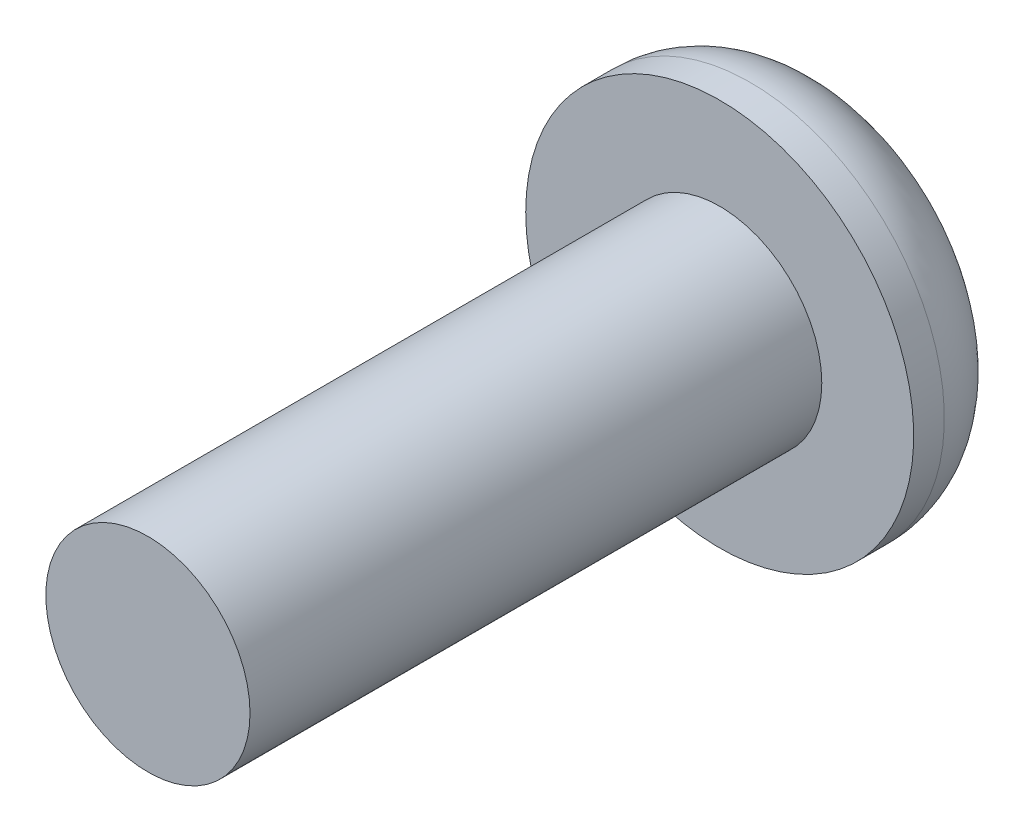
ISO-10303-21;
HEADER;
FILE_DESCRIPTION(('STEP AP214'),'2;1');
FILE_NAME('part.step','',(''),(''),'','','');
FILE_SCHEMA(('AUTOMOTIVE_DESIGN { 1 0 10303 214 1 1 1 1 }'));
ENDSEC;
DATA;
#1=APPLICATION_CONTEXT('core data for automotive mechanical design processes');
#2=APPLICATION_PROTOCOL_DEFINITION('international standard','automotive_design',2000,#1);
#3=PRODUCT_CONTEXT('',#1,'mechanical');
#4=PRODUCT('Part','Part','',(#3));
#5=PRODUCT_RELATED_PRODUCT_CATEGORY('part','',(#4));
#6=PRODUCT_DEFINITION_FORMATION('','',#4);
#7=PRODUCT_DEFINITION_CONTEXT('part definition',#1,'design');
#8=PRODUCT_DEFINITION('design','',#6,#7);
#9=PRODUCT_DEFINITION_SHAPE('','',#8);
#10=(LENGTH_UNIT() NAMED_UNIT(*) SI_UNIT(.MILLI.,.METRE.));
#11=(NAMED_UNIT(*) PLANE_ANGLE_UNIT() SI_UNIT($,.RADIAN.));
#12=(NAMED_UNIT(*) SI_UNIT($,.STERADIAN.) SOLID_ANGLE_UNIT());
#13=UNCERTAINTY_MEASURE_WITH_UNIT(LENGTH_MEASURE(1.E-05),#10,'distance_accuracy_value','');
#14=(GEOMETRIC_REPRESENTATION_CONTEXT(3) GLOBAL_UNCERTAINTY_ASSIGNED_CONTEXT((#13)) GLOBAL_UNIT_ASSIGNED_CONTEXT((#10,
#11,#12)) REPRESENTATION_CONTEXT('',''));
#15=CARTESIAN_POINT('',(0.,0.,0.));
#16=DIRECTION('',(0.,0.,1.));
#17=DIRECTION('',(1.,0.,0.));
#18=AXIS2_PLACEMENT_3D('',#15,#16,#17);
#19=CARTESIAN_POINT('',(0.,0.,14.));
#20=DIRECTION('',(0.,0.,-1.));
#21=DIRECTION('',(-1.,0.,0.));
#22=AXIS2_PLACEMENT_3D('',#19,#20,#21);
#23=CYLINDRICAL_SURFACE('',#22,2.5);
#24=CARTESIAN_POINT('',(0.,0.,14.));
#25=DIRECTION('',(0.,0.,1.));
#26=DIRECTION('',(1.,0.,0.));
#27=AXIS2_PLACEMENT_3D('',#24,#25,#26);
#28=CIRCLE('',#27,2.5);
#29=CARTESIAN_POINT('',(2.5,0.,14.));
#30=VERTEX_POINT('',#29);
#31=EDGE_CURVE('E50',#30,#30,#28,.T.);
#32=ORIENTED_EDGE('',*,*,#31,.F.);
#33=EDGE_LOOP('',(#32));
#34=FACE_BOUND('',#33,.T.);
#35=CARTESIAN_POINT('',(0.,0.,0.));
#36=DIRECTION('',(0.,0.,1.));
#37=DIRECTION('',(1.,0.,0.));
#38=AXIS2_PLACEMENT_3D('',#35,#36,#37);
#39=CIRCLE('',#38,2.5);
#40=CARTESIAN_POINT('',(2.5,0.,0.));
#41=VERTEX_POINT('',#40);
#42=EDGE_CURVE('E55',#41,#41,#39,.T.);
#43=ORIENTED_EDGE('',*,*,#42,.T.);
#44=EDGE_LOOP('',(#43));
#45=FACE_BOUND('',#44,.T.);
#46=ADVANCED_FACE('F37',(#34,#45),#23,.T.);
#47=CARTESIAN_POINT('',(0.,0.,14.));
#48=DIRECTION('',(0.,0.,1.));
#49=DIRECTION('',(1.,0.,0.));
#50=AXIS2_PLACEMENT_3D('',#47,#48,#49);
#51=PLANE('',#50);
#52=ORIENTED_EDGE('',*,*,#31,.T.);
#53=EDGE_LOOP('',(#52));
#54=FACE_BOUND('',#53,.T.);
#55=ADVANCED_FACE('F82',(#54),#51,.T.);
#56=CARTESIAN_POINT('',(0.,0.,-2.75));
#57=DIRECTION('',(0.,0.,1.));
#58=DIRECTION('',(1.,0.,0.));
#59=AXIS2_PLACEMENT_3D('',#56,#57,#58);
#60=CYLINDRICAL_SURFACE('',#59,4.75);
#61=CARTESIAN_POINT('',(0.,0.,-0.75));
#62=DIRECTION('',(0.,0.,-1.));
#63=DIRECTION('',(-1.,0.,0.));
#64=AXIS2_PLACEMENT_3D('',#61,#62,#63);
#65=CIRCLE('',#64,4.75);
#66=CARTESIAN_POINT('',(-4.75,0.,-0.75));
#67=VERTEX_POINT('',#66);
#68=EDGE_CURVE('E10',#67,#67,#65,.F.);
#69=ORIENTED_EDGE('',*,*,#68,.T.);
#70=EDGE_LOOP('',(#69));
#71=FACE_BOUND('',#70,.T.);
#72=CARTESIAN_POINT('',(0.,0.,0.));
#73=DIRECTION('',(0.,0.,-1.));
#74=DIRECTION('',(-1.,0.,0.));
#75=AXIS2_PLACEMENT_3D('',#72,#73,#74);
#76=CIRCLE('',#75,4.75);
#77=CARTESIAN_POINT('',(-4.75,0.,0.));
#78=VERTEX_POINT('',#77);
#79=EDGE_CURVE('E60',#78,#78,#76,.T.);
#80=ORIENTED_EDGE('',*,*,#79,.T.);
#81=EDGE_LOOP('',(#80));
#82=FACE_BOUND('',#81,.T.);
#83=ADVANCED_FACE('F66',(#71,#82),#60,.T.);
#84=CARTESIAN_POINT('',(0.,0.,-2.75));
#85=DIRECTION('',(0.,0.,-1.));
#86=DIRECTION('',(-1.,0.,0.));
#87=AXIS2_PLACEMENT_3D('',#84,#85,#86);
#88=PLANE('',#87);
#89=CARTESIAN_POINT('',(0.,0.,-2.75));
#90=DIRECTION('',(0.,0.,-1.));
#91=DIRECTION('',(-1.,0.,0.));
#92=AXIS2_PLACEMENT_3D('',#89,#90,#91);
#93=CIRCLE('',#92,2.75);
#94=CARTESIAN_POINT('',(-2.75,0.,-2.75));
#95=VERTEX_POINT('',#94);
#96=EDGE_CURVE('E45',#95,#95,#93,.T.);
#97=ORIENTED_EDGE('',*,*,#96,.T.);
#98=EDGE_LOOP('',(#97));
#99=FACE_BOUND('',#98,.T.);
#100=ADVANCED_FACE('F70',(#99),#88,.T.);
#101=CARTESIAN_POINT('',(0.,0.,0.));
#102=DIRECTION('',(0.,0.,-1.));
#103=DIRECTION('',(-1.,0.,0.));
#104=AXIS2_PLACEMENT_3D('',#101,#102,#103);
#105=PLANE('',#104);
#106=ORIENTED_EDGE('',*,*,#42,.F.);
#107=EDGE_LOOP('',(#106));
#108=FACE_BOUND('',#107,.T.);
#109=ORIENTED_EDGE('',*,*,#79,.F.);
#110=EDGE_LOOP('',(#109));
#111=FACE_BOUND('',#110,.T.);
#112=ADVANCED_FACE('F68',(#108,#111),#105,.F.);
#113=CARTESIAN_POINT('',(0.,0.,-0.75));
#114=DIRECTION('',(0.,0.,-1.));
#115=DIRECTION('',(-1.,0.,0.));
#116=AXIS2_PLACEMENT_3D('',#113,#114,#115);
#117=TOROIDAL_SURFACE('',#116,2.75,2.);
#118=ORIENTED_EDGE('',*,*,#68,.F.);
#119=EDGE_LOOP('',(#118));
#120=FACE_BOUND('',#119,.T.);
#121=ORIENTED_EDGE('',*,*,#96,.F.);
#122=EDGE_LOOP('',(#121));
#123=FACE_BOUND('',#122,.T.);
#124=ADVANCED_FACE('F39',(#120,#123),#117,.T.);
#125=CLOSED_SHELL('',(#46,#55,#83,#100,#112,#124));
#126=MANIFOLD_SOLID_BREP('B2',#125);
#127=ADVANCED_BREP_SHAPE_REPRESENTATION('',(#18,#126),#14);
#128=SHAPE_DEFINITION_REPRESENTATION(#9,#127);
ENDSEC;
END-ISO-10303-21;
